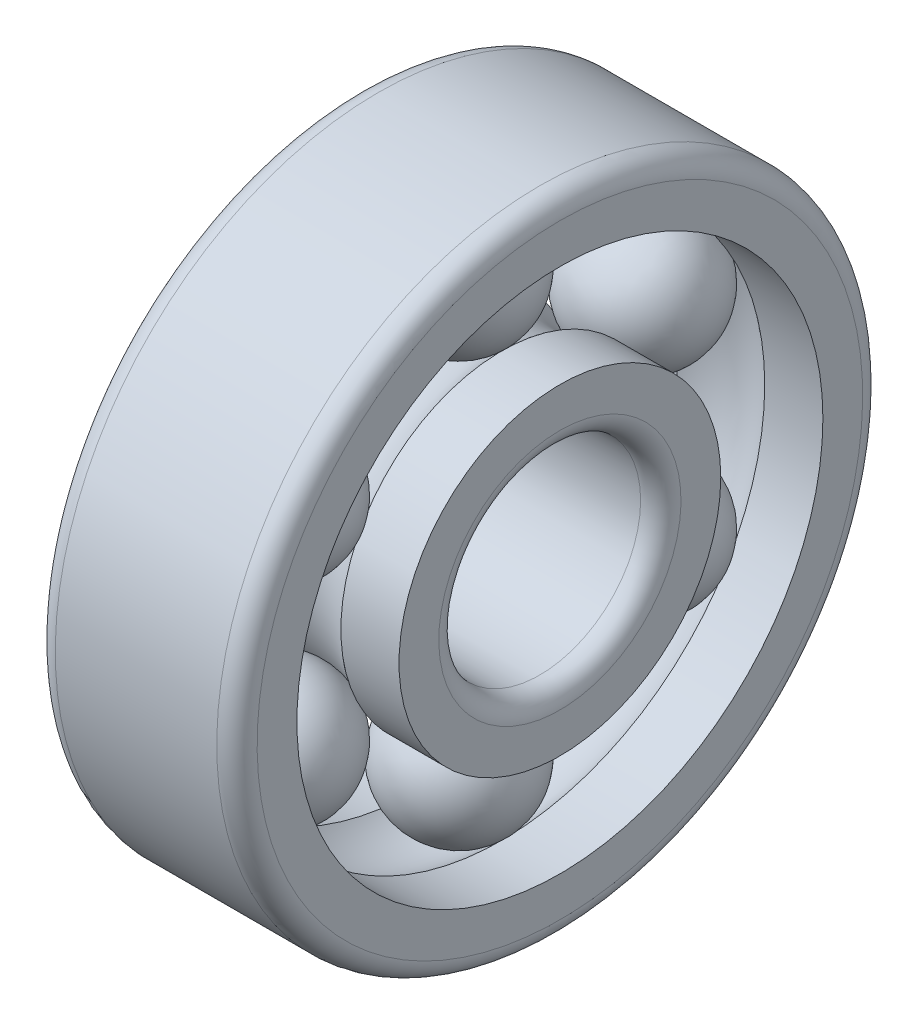
ISO-10303-21;
HEADER;
FILE_DESCRIPTION(('STEP AP214'),'2;1');
FILE_NAME('part.step','',(''),(''),'','','');
FILE_SCHEMA(('AUTOMOTIVE_DESIGN { 1 0 10303 214 1 1 1 1 }'));
ENDSEC;
DATA;
#1=APPLICATION_CONTEXT('core data for automotive mechanical design processes');
#2=APPLICATION_PROTOCOL_DEFINITION('international standard','automotive_design',2000,#1);
#3=PRODUCT_CONTEXT('',#1,'mechanical');
#4=PRODUCT('Part','Part','',(#3));
#5=PRODUCT_RELATED_PRODUCT_CATEGORY('part','',(#4));
#6=PRODUCT_DEFINITION_FORMATION('','',#4);
#7=PRODUCT_DEFINITION_CONTEXT('part definition',#1,'design');
#8=PRODUCT_DEFINITION('design','',#6,#7);
#9=PRODUCT_DEFINITION_SHAPE('','',#8);
#10=(LENGTH_UNIT() NAMED_UNIT(*) SI_UNIT(.MILLI.,.METRE.));
#11=(NAMED_UNIT(*) PLANE_ANGLE_UNIT() SI_UNIT($,.RADIAN.));
#12=(NAMED_UNIT(*) SI_UNIT($,.STERADIAN.) SOLID_ANGLE_UNIT());
#13=UNCERTAINTY_MEASURE_WITH_UNIT(LENGTH_MEASURE(1.E-05),#10,'distance_accuracy_value','');
#14=(GEOMETRIC_REPRESENTATION_CONTEXT(3) GLOBAL_UNCERTAINTY_ASSIGNED_CONTEXT((#13)) GLOBAL_UNIT_ASSIGNED_CONTEXT((#10,
#11,#12)) REPRESENTATION_CONTEXT('',''));
#15=CARTESIAN_POINT('',(0.,0.,0.));
#16=DIRECTION('',(0.,0.,1.));
#17=DIRECTION('',(1.,0.,0.));
#18=AXIS2_PLACEMENT_3D('',#15,#16,#17);
#19=CARTESIAN_POINT('',(0.,2.625,4.54663336986831));
#20=DIRECTION('',(1.,0.,0.));
#21=DIRECTION('',(0.,-0.866025403784439,0.499999999999999));
#22=AXIS2_PLACEMENT_3D('',#19,#20,#21);
#23=SPHERICAL_SURFACE('',#22,1.65);
#24=CARTESIAN_POINT('',(-1.64999999999999,2.625,4.54663336986831));
#25=VERTEX_POINT('',#24);
#26=VERTEX_LOOP('',#25);
#27=FACE_BOUND('',#26,.T.);
#28=CARTESIAN_POINT('',(1.65000000000001,2.625,4.54663336986831));
#29=VERTEX_POINT('',#28);
#30=VERTEX_LOOP('',#29);
#31=FACE_BOUND('',#30,.T.);
#32=ADVANCED_FACE('P0_F15',(#27,#31),#23,.T.);
#33=CLOSED_SHELL('',(#32));
#34=MANIFOLD_SOLID_BREP('P0_B1',#33);
#35=CARTESIAN_POINT('',(0.,-2.625,4.5466333698683));
#36=DIRECTION('',(1.,0.,0.));
#37=DIRECTION('',(0.,-0.866025403784438,-0.5));
#38=AXIS2_PLACEMENT_3D('',#35,#36,#37);
#39=SPHERICAL_SURFACE('',#38,1.65);
#40=CARTESIAN_POINT('',(-1.64999999999999,-2.625,4.5466333698683));
#41=VERTEX_POINT('',#40);
#42=VERTEX_LOOP('',#41);
#43=FACE_BOUND('',#42,.T.);
#44=CARTESIAN_POINT('',(1.65000000000001,-2.625,4.5466333698683));
#45=VERTEX_POINT('',#44);
#46=VERTEX_LOOP('',#45);
#47=FACE_BOUND('',#46,.T.);
#48=ADVANCED_FACE('P1_F15',(#43,#47),#39,.T.);
#49=CLOSED_SHELL('',(#48));
#50=MANIFOLD_SOLID_BREP('P1_B1',#49);
#51=CARTESIAN_POINT('',(0.,-5.25,0.));
#52=DIRECTION('',(1.,0.,0.));
#53=DIRECTION('',(0.,0.,-1.));
#54=AXIS2_PLACEMENT_3D('',#51,#52,#53);
#55=SPHERICAL_SURFACE('',#54,1.65);
#56=CARTESIAN_POINT('',(-1.64999999999999,-5.25,0.));
#57=VERTEX_POINT('',#56);
#58=VERTEX_LOOP('',#57);
#59=FACE_BOUND('',#58,.T.);
#60=CARTESIAN_POINT('',(1.65000000000001,-5.25,0.));
#61=VERTEX_POINT('',#60);
#62=VERTEX_LOOP('',#61);
#63=FACE_BOUND('',#62,.T.);
#64=ADVANCED_FACE('P2_F15',(#59,#63),#55,.T.);
#65=CLOSED_SHELL('',(#64));
#66=MANIFOLD_SOLID_BREP('P2_B1',#65);
#67=CARTESIAN_POINT('',(0.,-2.625,-4.5466333698683));
#68=DIRECTION('',(1.,0.,0.));
#69=DIRECTION('',(0.,0.866025403784439,-0.5));
#70=AXIS2_PLACEMENT_3D('',#67,#68,#69);
#71=SPHERICAL_SURFACE('',#70,1.65);
#72=CARTESIAN_POINT('',(-1.64999999999999,-2.625,-4.5466333698683));
#73=VERTEX_POINT('',#72);
#74=VERTEX_LOOP('',#73);
#75=FACE_BOUND('',#74,.T.);
#76=CARTESIAN_POINT('',(1.65000000000001,-2.625,-4.5466333698683));
#77=VERTEX_POINT('',#76);
#78=VERTEX_LOOP('',#77);
#79=FACE_BOUND('',#78,.T.);
#80=ADVANCED_FACE('P3_F15',(#75,#79),#71,.T.);
#81=CLOSED_SHELL('',(#80));
#82=MANIFOLD_SOLID_BREP('P3_B1',#81);
#83=CARTESIAN_POINT('',(0.,2.625,-4.5466333698683));
#84=DIRECTION('',(1.,0.,0.));
#85=DIRECTION('',(0.,0.866025403784439,0.5));
#86=AXIS2_PLACEMENT_3D('',#83,#84,#85);
#87=SPHERICAL_SURFACE('',#86,1.65);
#88=CARTESIAN_POINT('',(-1.64999999999999,2.625,-4.5466333698683));
#89=VERTEX_POINT('',#88);
#90=VERTEX_LOOP('',#89);
#91=FACE_BOUND('',#90,.T.);
#92=CARTESIAN_POINT('',(1.65000000000001,2.625,-4.5466333698683));
#93=VERTEX_POINT('',#92);
#94=VERTEX_LOOP('',#93);
#95=FACE_BOUND('',#94,.T.);
#96=ADVANCED_FACE('P4_F15',(#91,#95),#87,.T.);
#97=CLOSED_SHELL('',(#96));
#98=MANIFOLD_SOLID_BREP('P4_B1',#97);
#99=CARTESIAN_POINT('',(0.,5.25,0.));
#100=DIRECTION('',(1.,0.,0.));
#101=DIRECTION('',(0.,0.,1.));
#102=AXIS2_PLACEMENT_3D('',#99,#100,#101);
#103=SPHERICAL_SURFACE('',#102,1.65);
#104=CARTESIAN_POINT('',(-1.64999999999999,5.25,0.));
#105=VERTEX_POINT('',#104);
#106=VERTEX_LOOP('',#105);
#107=FACE_BOUND('',#106,.T.);
#108=CARTESIAN_POINT('',(1.65000000000001,5.25,0.));
#109=VERTEX_POINT('',#108);
#110=VERTEX_LOOP('',#109);
#111=FACE_BOUND('',#110,.T.);
#112=ADVANCED_FACE('P5_F15',(#107,#111),#103,.T.);
#113=CLOSED_SHELL('',(#112));
#114=MANIFOLD_SOLID_BREP('P5_B1',#113);
#115=CARTESIAN_POINT('',(0.,0.,0.));
#116=DIRECTION('',(1.,0.,0.));
#117=DIRECTION('',(0.,1.,0.));
#118=AXIS2_PLACEMENT_3D('',#115,#116,#117);
#119=TOROIDAL_SURFACE('',#118,5.25,1.65);
#120=CARTESIAN_POINT('',(-1.05937481563421,0.,0.));
#121=DIRECTION('',(1.,0.,0.));
#122=DIRECTION('',(0.,0.,-1.));
#123=AXIS2_PLACEMENT_3D('',#120,#121,#122);
#124=CIRCLE('',#123,6.515);
#125=CARTESIAN_POINT('',(-1.05937481563421,0.,-6.515));
#126=VERTEX_POINT('',#125);
#127=EDGE_CURVE('P6_E109',#126,#126,#124,.F.);
#128=ORIENTED_EDGE('',*,*,#127,.T.);
#129=EDGE_LOOP('',(#128));
#130=FACE_BOUND('',#129,.T.);
#131=CARTESIAN_POINT('',(1.05937481563421,0.,0.));
#132=DIRECTION('',(1.,0.,0.));
#133=DIRECTION('',(0.,0.,-1.));
#134=AXIS2_PLACEMENT_3D('',#131,#132,#133);
#135=CIRCLE('',#134,6.515);
#136=CARTESIAN_POINT('',(1.05937481563421,0.,-6.515));
#137=VERTEX_POINT('',#136);
#138=EDGE_CURVE('P6_E114',#137,#137,#135,.T.);
#139=ORIENTED_EDGE('',*,*,#138,.T.);
#140=EDGE_LOOP('',(#139));
#141=FACE_BOUND('',#140,.T.);
#142=ADVANCED_FACE('P6_F14',(#130,#141),#119,.F.);
#143=CARTESIAN_POINT('',(2.50000000000002,0.,0.));
#144=DIRECTION('',(1.,0.,0.));
#145=DIRECTION('',(0.,0.,-1.));
#146=AXIS2_PLACEMENT_3D('',#143,#144,#145);
#147=CYLINDRICAL_SURFACE('',#146,6.515);
#148=ORIENTED_EDGE('',*,*,#138,.F.);
#149=EDGE_LOOP('',(#148));
#150=FACE_BOUND('',#149,.T.);
#151=CARTESIAN_POINT('',(2.50000000000002,0.,0.));
#152=DIRECTION('',(1.,0.,0.));
#153=DIRECTION('',(0.,0.,-1.));
#154=AXIS2_PLACEMENT_3D('',#151,#152,#153);
#155=CIRCLE('',#154,6.515);
#156=CARTESIAN_POINT('',(2.50000000000002,0.,-6.515));
#157=VERTEX_POINT('',#156);
#158=EDGE_CURVE('P6_E18',#157,#157,#155,.F.);
#159=ORIENTED_EDGE('',*,*,#158,.F.);
#160=EDGE_LOOP('',(#159));
#161=FACE_BOUND('',#160,.T.);
#162=ADVANCED_FACE('P6_F85',(#150,#161),#147,.F.);
#163=CARTESIAN_POINT('',(2.50000000000002,0.,0.));
#164=DIRECTION('',(1.,0.,0.));
#165=DIRECTION('',(0.,0.,-1.));
#166=AXIS2_PLACEMENT_3D('',#163,#164,#165);
#167=CYLINDRICAL_SURFACE('',#166,6.515);
#168=CARTESIAN_POINT('',(-2.49999999999998,0.,0.));
#169=DIRECTION('',(1.,0.,0.));
#170=DIRECTION('',(0.,0.,-1.));
#171=AXIS2_PLACEMENT_3D('',#168,#169,#170);
#172=CIRCLE('',#171,6.515);
#173=CARTESIAN_POINT('',(-2.49999999999998,0.,-6.515));
#174=VERTEX_POINT('',#173);
#175=EDGE_CURVE('P6_E104',#174,#174,#172,.T.);
#176=ORIENTED_EDGE('',*,*,#175,.F.);
#177=EDGE_LOOP('',(#176));
#178=FACE_BOUND('',#177,.T.);
#179=ORIENTED_EDGE('',*,*,#127,.F.);
#180=EDGE_LOOP('',(#179));
#181=FACE_BOUND('',#180,.T.);
#182=ADVANCED_FACE('P6_F81',(#178,#181),#167,.F.);
#183=CARTESIAN_POINT('',(2.50000000000002,0.,0.));
#184=DIRECTION('',(1.,0.,0.));
#185=DIRECTION('',(0.,0.,-1.));
#186=AXIS2_PLACEMENT_3D('',#183,#184,#185);
#187=PLANE('',#186);
#188=ORIENTED_EDGE('',*,*,#158,.T.);
#189=EDGE_LOOP('',(#188));
#190=FACE_BOUND('',#189,.T.);
#191=CARTESIAN_POINT('',(2.50000000000002,0.,0.));
#192=DIRECTION('',(-1.,0.,0.));
#193=DIRECTION('',(0.,1.,0.));
#194=AXIS2_PLACEMENT_3D('',#191,#192,#193);
#195=CIRCLE('',#194,7.5);
#196=CARTESIAN_POINT('',(2.50000000000002,7.5,0.));
#197=VERTEX_POINT('',#196);
#198=EDGE_CURVE('P6_E65',#197,#197,#195,.T.);
#199=ORIENTED_EDGE('',*,*,#198,.F.);
#200=EDGE_LOOP('',(#199));
#201=FACE_BOUND('',#200,.T.);
#202=ADVANCED_FACE('P6_F71',(#190,#201),#187,.T.);
#203=CARTESIAN_POINT('',(-2.49999999999998,0.,0.));
#204=DIRECTION('',(-1.,0.,0.));
#205=DIRECTION('',(0.,0.,1.));
#206=AXIS2_PLACEMENT_3D('',#203,#204,#205);
#207=PLANE('',#206);
#208=ORIENTED_EDGE('',*,*,#175,.T.);
#209=EDGE_LOOP('',(#208));
#210=FACE_BOUND('',#209,.T.);
#211=CARTESIAN_POINT('',(-2.49999999999998,0.,0.));
#212=DIRECTION('',(1.,0.,0.));
#213=DIRECTION('',(0.,1.,0.));
#214=AXIS2_PLACEMENT_3D('',#211,#212,#213);
#215=CIRCLE('',#214,7.5);
#216=CARTESIAN_POINT('',(-2.49999999999998,7.5,0.));
#217=VERTEX_POINT('',#216);
#218=EDGE_CURVE('P6_E27',#217,#217,#215,.T.);
#219=ORIENTED_EDGE('',*,*,#218,.F.);
#220=EDGE_LOOP('',(#219));
#221=FACE_BOUND('',#220,.T.);
#222=ADVANCED_FACE('P6_F80',(#210,#221),#207,.T.);
#223=CARTESIAN_POINT('',(2.00000000000002,0.,0.));
#224=DIRECTION('',(1.,0.,0.));
#225=DIRECTION('',(0.,1.,0.));
#226=AXIS2_PLACEMENT_3D('',#223,#224,#225);
#227=TOROIDAL_SURFACE('',#226,7.5,0.5);
#228=CARTESIAN_POINT('',(2.00000000000002,0.,0.));
#229=DIRECTION('',(1.,0.,0.));
#230=DIRECTION('',(0.,0.,-1.));
#231=AXIS2_PLACEMENT_3D('',#228,#229,#230);
#232=CIRCLE('',#231,8.);
#233=CARTESIAN_POINT('',(2.00000000000002,0.,-8.));
#234=VERTEX_POINT('',#233);
#235=EDGE_CURVE('P6_E22',#234,#234,#232,.F.);
#236=ORIENTED_EDGE('',*,*,#235,.F.);
#237=EDGE_LOOP('',(#236));
#238=FACE_BOUND('',#237,.T.);
#239=ORIENTED_EDGE('',*,*,#198,.T.);
#240=EDGE_LOOP('',(#239));
#241=FACE_BOUND('',#240,.T.);
#242=ADVANCED_FACE('P6_F45',(#238,#241),#227,.T.);
#243=CARTESIAN_POINT('',(-1.99999999999998,0.,0.));
#244=DIRECTION('',(1.,0.,0.));
#245=DIRECTION('',(0.,1.,0.));
#246=AXIS2_PLACEMENT_3D('',#243,#244,#245);
#247=TOROIDAL_SURFACE('',#246,7.5,0.5);
#248=ORIENTED_EDGE('',*,*,#218,.T.);
#249=EDGE_LOOP('',(#248));
#250=FACE_BOUND('',#249,.T.);
#251=CARTESIAN_POINT('',(-1.99999999999998,0.,0.));
#252=DIRECTION('',(1.,0.,0.));
#253=DIRECTION('',(0.,0.,-1.));
#254=AXIS2_PLACEMENT_3D('',#251,#252,#253);
#255=CIRCLE('',#254,8.);
#256=CARTESIAN_POINT('',(-1.99999999999998,0.,-8.));
#257=VERTEX_POINT('',#256);
#258=EDGE_CURVE('P6_E10',#257,#257,#255,.T.);
#259=ORIENTED_EDGE('',*,*,#258,.F.);
#260=EDGE_LOOP('',(#259));
#261=FACE_BOUND('',#260,.T.);
#262=ADVANCED_FACE('P6_F39',(#250,#261),#247,.T.);
#263=CARTESIAN_POINT('',(-2.49999999999998,0.,0.));
#264=DIRECTION('',(1.,0.,0.));
#265=DIRECTION('',(0.,0.,-1.));
#266=AXIS2_PLACEMENT_3D('',#263,#264,#265);
#267=CYLINDRICAL_SURFACE('',#266,8.);
#268=ORIENTED_EDGE('',*,*,#258,.T.);
#269=EDGE_LOOP('',(#268));
#270=FACE_BOUND('',#269,.T.);
#271=ORIENTED_EDGE('',*,*,#235,.T.);
#272=EDGE_LOOP('',(#271));
#273=FACE_BOUND('',#272,.T.);
#274=ADVANCED_FACE('P6_F44',(#270,#273),#267,.T.);
#275=CLOSED_SHELL('',(#142,#162,#182,#202,#222,#242,#262,#274));
#276=MANIFOLD_SOLID_BREP('P6_B1',#275);
#277=CARTESIAN_POINT('',(0.,0.,0.));
#278=DIRECTION('',(1.,0.,0.));
#279=DIRECTION('',(0.,1.,0.));
#280=AXIS2_PLACEMENT_3D('',#277,#278,#279);
#281=TOROIDAL_SURFACE('',#280,5.25,1.65);
#282=CARTESIAN_POINT('',(-1.05937481563419,0.,0.));
#283=DIRECTION('',(1.,0.,0.));
#284=DIRECTION('',(0.,0.,-1.));
#285=AXIS2_PLACEMENT_3D('',#282,#283,#284);
#286=CIRCLE('',#285,3.98499999999999);
#287=CARTESIAN_POINT('',(-1.05937481563419,0.,-3.98499999999999));
#288=VERTEX_POINT('',#287);
#289=EDGE_CURVE('P7_E109',#288,#288,#286,.F.);
#290=ORIENTED_EDGE('',*,*,#289,.F.);
#291=EDGE_LOOP('',(#290));
#292=FACE_BOUND('',#291,.T.);
#293=CARTESIAN_POINT('',(1.05937481563419,0.,0.));
#294=DIRECTION('',(1.,0.,0.));
#295=DIRECTION('',(0.,0.,-1.));
#296=AXIS2_PLACEMENT_3D('',#293,#294,#295);
#297=CIRCLE('',#296,3.98499999999999);
#298=CARTESIAN_POINT('',(1.05937481563419,0.,-3.98499999999999));
#299=VERTEX_POINT('',#298);
#300=EDGE_CURVE('P7_E114',#299,#299,#297,.T.);
#301=ORIENTED_EDGE('',*,*,#300,.F.);
#302=EDGE_LOOP('',(#301));
#303=FACE_BOUND('',#302,.T.);
#304=ADVANCED_FACE('P7_F14',(#292,#303),#281,.F.);
#305=CARTESIAN_POINT('',(-2.49999999999999,0.,0.));
#306=DIRECTION('',(1.,0.,0.));
#307=DIRECTION('',(0.,0.,-1.));
#308=AXIS2_PLACEMENT_3D('',#305,#306,#307);
#309=CYLINDRICAL_SURFACE('',#308,3.98499999999999);
#310=ORIENTED_EDGE('',*,*,#300,.T.);
#311=EDGE_LOOP('',(#310));
#312=FACE_BOUND('',#311,.T.);
#313=CARTESIAN_POINT('',(2.5,0.,0.));
#314=DIRECTION('',(1.,0.,0.));
#315=DIRECTION('',(0.,0.,-1.));
#316=AXIS2_PLACEMENT_3D('',#313,#314,#315);
#317=CIRCLE('',#316,3.98499999999999);
#318=CARTESIAN_POINT('',(2.5,0.,-3.98499999999999));
#319=VERTEX_POINT('',#318);
#320=EDGE_CURVE('P7_E18',#319,#319,#317,.T.);
#321=ORIENTED_EDGE('',*,*,#320,.F.);
#322=EDGE_LOOP('',(#321));
#323=FACE_BOUND('',#322,.T.);
#324=ADVANCED_FACE('P7_F84',(#312,#323),#309,.T.);
#325=CARTESIAN_POINT('',(-2.49999999999999,0.,0.));
#326=DIRECTION('',(1.,0.,0.));
#327=DIRECTION('',(0.,0.,-1.));
#328=AXIS2_PLACEMENT_3D('',#325,#326,#327);
#329=CYLINDRICAL_SURFACE('',#328,3.98499999999999);
#330=CARTESIAN_POINT('',(-2.49999999999999,0.,0.));
#331=DIRECTION('',(1.,0.,0.));
#332=DIRECTION('',(0.,0.,-1.));
#333=AXIS2_PLACEMENT_3D('',#330,#331,#332);
#334=CIRCLE('',#333,3.98499999999999);
#335=CARTESIAN_POINT('',(-2.49999999999999,0.,-3.98499999999999));
#336=VERTEX_POINT('',#335);
#337=EDGE_CURVE('P7_E104',#336,#336,#334,.F.);
#338=ORIENTED_EDGE('',*,*,#337,.F.);
#339=EDGE_LOOP('',(#338));
#340=FACE_BOUND('',#339,.T.);
#341=ORIENTED_EDGE('',*,*,#289,.T.);
#342=EDGE_LOOP('',(#341));
#343=FACE_BOUND('',#342,.T.);
#344=ADVANCED_FACE('P7_F81',(#340,#343),#329,.T.);
#345=CARTESIAN_POINT('',(2.50000000000001,0.,0.));
#346=DIRECTION('',(1.,0.,0.));
#347=DIRECTION('',(0.,0.,-1.));
#348=AXIS2_PLACEMENT_3D('',#345,#346,#347);
#349=PLANE('',#348);
#350=CARTESIAN_POINT('',(2.50000000000001,0.,0.));
#351=DIRECTION('',(1.,0.,0.));
#352=DIRECTION('',(0.,1.,0.));
#353=AXIS2_PLACEMENT_3D('',#350,#351,#352);
#354=CIRCLE('',#353,3.);
#355=CARTESIAN_POINT('',(2.50000000000001,3.,0.));
#356=VERTEX_POINT('',#355);
#357=EDGE_CURVE('P7_E65',#356,#356,#354,.T.);
#358=ORIENTED_EDGE('',*,*,#357,.F.);
#359=EDGE_LOOP('',(#358));
#360=FACE_BOUND('',#359,.T.);
#361=ORIENTED_EDGE('',*,*,#320,.T.);
#362=EDGE_LOOP('',(#361));
#363=FACE_BOUND('',#362,.T.);
#364=ADVANCED_FACE('P7_F71',(#360,#363),#349,.T.);
#365=CARTESIAN_POINT('',(-2.49999999999999,0.,0.));
#366=DIRECTION('',(-1.,0.,0.));
#367=DIRECTION('',(0.,0.,1.));
#368=AXIS2_PLACEMENT_3D('',#365,#366,#367);
#369=PLANE('',#368);
#370=CARTESIAN_POINT('',(-2.49999999999999,0.,0.));
#371=DIRECTION('',(-1.,0.,0.));
#372=DIRECTION('',(0.,1.,0.));
#373=AXIS2_PLACEMENT_3D('',#370,#371,#372);
#374=CIRCLE('',#373,3.);
#375=CARTESIAN_POINT('',(-2.49999999999999,3.,0.));
#376=VERTEX_POINT('',#375);
#377=EDGE_CURVE('P7_E27',#376,#376,#374,.T.);
#378=ORIENTED_EDGE('',*,*,#377,.F.);
#379=EDGE_LOOP('',(#378));
#380=FACE_BOUND('',#379,.T.);
#381=ORIENTED_EDGE('',*,*,#337,.T.);
#382=EDGE_LOOP('',(#381));
#383=FACE_BOUND('',#382,.T.);
#384=ADVANCED_FACE('P7_F80',(#380,#383),#369,.T.);
#385=CARTESIAN_POINT('',(2.00000000000001,0.,0.));
#386=DIRECTION('',(1.,0.,0.));
#387=DIRECTION('',(0.,1.,0.));
#388=AXIS2_PLACEMENT_3D('',#385,#386,#387);
#389=TOROIDAL_SURFACE('',#388,3.,0.5);
#390=CARTESIAN_POINT('',(2.00000000000001,0.,0.));
#391=DIRECTION('',(1.,0.,0.));
#392=DIRECTION('',(0.,0.,-1.));
#393=AXIS2_PLACEMENT_3D('',#390,#391,#392);
#394=CIRCLE('',#393,2.5);
#395=CARTESIAN_POINT('',(2.00000000000001,0.,-2.5));
#396=VERTEX_POINT('',#395);
#397=EDGE_CURVE('P7_E22',#396,#396,#394,.F.);
#398=ORIENTED_EDGE('',*,*,#397,.T.);
#399=EDGE_LOOP('',(#398));
#400=FACE_BOUND('',#399,.T.);
#401=ORIENTED_EDGE('',*,*,#357,.T.);
#402=EDGE_LOOP('',(#401));
#403=FACE_BOUND('',#402,.T.);
#404=ADVANCED_FACE('P7_F45',(#400,#403),#389,.T.);
#405=CARTESIAN_POINT('',(-1.99999999999999,0.,0.));
#406=DIRECTION('',(1.,0.,0.));
#407=DIRECTION('',(0.,1.,0.));
#408=AXIS2_PLACEMENT_3D('',#405,#406,#407);
#409=TOROIDAL_SURFACE('',#408,3.,0.5);
#410=ORIENTED_EDGE('',*,*,#377,.T.);
#411=EDGE_LOOP('',(#410));
#412=FACE_BOUND('',#411,.T.);
#413=CARTESIAN_POINT('',(-1.99999999999999,0.,0.));
#414=DIRECTION('',(1.,0.,0.));
#415=DIRECTION('',(0.,0.,-1.));
#416=AXIS2_PLACEMENT_3D('',#413,#414,#415);
#417=CIRCLE('',#416,2.5);
#418=CARTESIAN_POINT('',(-1.99999999999999,0.,-2.5));
#419=VERTEX_POINT('',#418);
#420=EDGE_CURVE('P7_E10',#419,#419,#417,.T.);
#421=ORIENTED_EDGE('',*,*,#420,.T.);
#422=EDGE_LOOP('',(#421));
#423=FACE_BOUND('',#422,.T.);
#424=ADVANCED_FACE('P7_F39',(#412,#423),#409,.T.);
#425=CARTESIAN_POINT('',(2.50000000000001,0.,0.));
#426=DIRECTION('',(1.,0.,0.));
#427=DIRECTION('',(0.,0.,-1.));
#428=AXIS2_PLACEMENT_3D('',#425,#426,#427);
#429=CYLINDRICAL_SURFACE('',#428,2.5);
#430=ORIENTED_EDGE('',*,*,#420,.F.);
#431=EDGE_LOOP('',(#430));
#432=FACE_BOUND('',#431,.T.);
#433=ORIENTED_EDGE('',*,*,#397,.F.);
#434=EDGE_LOOP('',(#433));
#435=FACE_BOUND('',#434,.T.);
#436=ADVANCED_FACE('P7_F44',(#432,#435),#429,.F.);
#437=CLOSED_SHELL('',(#304,#324,#344,#364,#384,#404,#424,#436));
#438=MANIFOLD_SOLID_BREP('P7_B1',#437);
#439=ADVANCED_BREP_SHAPE_REPRESENTATION('',(#18,#34,#50,#66,#82,#98,#114,#276,#438),#14);
#440=SHAPE_DEFINITION_REPRESENTATION(#9,#439);
ENDSEC;
END-ISO-10303-21;
